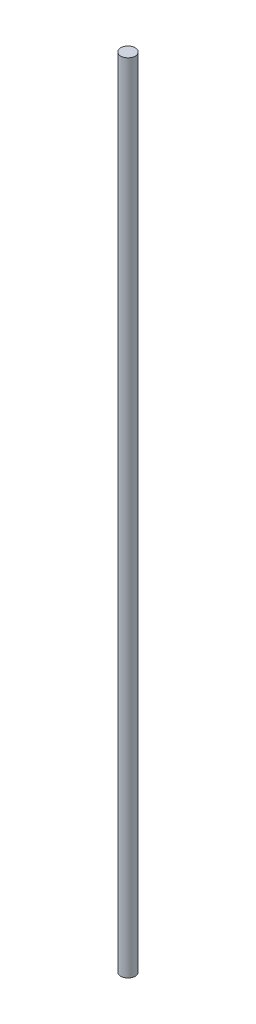
ISO-10303-21;
HEADER;
FILE_DESCRIPTION(('STEP AP214'),'2;1');
FILE_NAME('part.step','',(''),(''),'','','');
FILE_SCHEMA(('AUTOMOTIVE_DESIGN { 1 0 10303 214 1 1 1 1 }'));
ENDSEC;
DATA;
#1=APPLICATION_CONTEXT('core data for automotive mechanical design processes');
#2=APPLICATION_PROTOCOL_DEFINITION('international standard','automotive_design',2000,#1);
#3=PRODUCT_CONTEXT('',#1,'mechanical');
#4=PRODUCT('Part','Part','',(#3));
#5=PRODUCT_RELATED_PRODUCT_CATEGORY('part','',(#4));
#6=PRODUCT_DEFINITION_FORMATION('','',#4);
#7=PRODUCT_DEFINITION_CONTEXT('part definition',#1,'design');
#8=PRODUCT_DEFINITION('design','',#6,#7);
#9=PRODUCT_DEFINITION_SHAPE('','',#8);
#10=(LENGTH_UNIT() NAMED_UNIT(*) SI_UNIT(.MILLI.,.METRE.));
#11=(NAMED_UNIT(*) PLANE_ANGLE_UNIT() SI_UNIT($,.RADIAN.));
#12=(NAMED_UNIT(*) SI_UNIT($,.STERADIAN.) SOLID_ANGLE_UNIT());
#13=UNCERTAINTY_MEASURE_WITH_UNIT(LENGTH_MEASURE(1.E-05),#10,'distance_accuracy_value','');
#14=(GEOMETRIC_REPRESENTATION_CONTEXT(3) GLOBAL_UNCERTAINTY_ASSIGNED_CONTEXT((#13)) GLOBAL_UNIT_ASSIGNED_CONTEXT((#10,
#11,#12)) REPRESENTATION_CONTEXT('',''));
#15=CARTESIAN_POINT('',(0.,0.,0.));
#16=DIRECTION('',(0.,0.,1.));
#17=DIRECTION('',(1.,0.,0.));
#18=AXIS2_PLACEMENT_3D('',#15,#16,#17);
#19=CARTESIAN_POINT('',(0.,220.,0.));
#20=DIRECTION('',(0.,-1.,0.));
#21=DIRECTION('',(0.,0.,-1.));
#22=AXIS2_PLACEMENT_3D('',#19,#20,#21);
#23=CYLINDRICAL_SURFACE('',#22,2.);
#24=CARTESIAN_POINT('',(0.,220.,0.));
#25=DIRECTION('',(0.,1.,0.));
#26=DIRECTION('',(0.,0.,1.));
#27=AXIS2_PLACEMENT_3D('',#24,#25,#26);
#28=CIRCLE('',#27,2.);
#29=CARTESIAN_POINT('',(0.,220.,2.));
#30=VERTEX_POINT('',#29);
#31=EDGE_CURVE('E10',#30,#30,#28,.T.);
#32=ORIENTED_EDGE('',*,*,#31,.F.);
#33=EDGE_LOOP('',(#32));
#34=FACE_BOUND('',#33,.T.);
#35=CARTESIAN_POINT('',(0.,0.,0.));
#36=DIRECTION('',(0.,1.,0.));
#37=DIRECTION('',(0.,0.,1.));
#38=AXIS2_PLACEMENT_3D('',#35,#36,#37);
#39=CIRCLE('',#38,2.);
#40=CARTESIAN_POINT('',(0.,0.,2.));
#41=VERTEX_POINT('',#40);
#42=EDGE_CURVE('E34',#41,#41,#39,.T.);
#43=ORIENTED_EDGE('',*,*,#42,.T.);
#44=EDGE_LOOP('',(#43));
#45=FACE_BOUND('',#44,.T.);
#46=ADVANCED_FACE('F31',(#34,#45),#23,.T.);
#47=CARTESIAN_POINT('',(0.,220.,0.));
#48=DIRECTION('',(0.,1.,0.));
#49=DIRECTION('',(0.,0.,1.));
#50=AXIS2_PLACEMENT_3D('',#47,#48,#49);
#51=PLANE('',#50);
#52=ORIENTED_EDGE('',*,*,#31,.T.);
#53=EDGE_LOOP('',(#52));
#54=FACE_BOUND('',#53,.T.);
#55=ADVANCED_FACE('F46',(#54),#51,.T.);
#56=CARTESIAN_POINT('',(0.,0.,0.));
#57=DIRECTION('',(0.,1.,0.));
#58=DIRECTION('',(0.,0.,1.));
#59=AXIS2_PLACEMENT_3D('',#56,#57,#58);
#60=PLANE('',#59);
#61=ORIENTED_EDGE('',*,*,#42,.F.);
#62=EDGE_LOOP('',(#61));
#63=FACE_BOUND('',#62,.T.);
#64=ADVANCED_FACE('F44',(#63),#60,.F.);
#65=CLOSED_SHELL('',(#46,#55,#64));
#66=MANIFOLD_SOLID_BREP('B2',#65);
#67=ADVANCED_BREP_SHAPE_REPRESENTATION('',(#18,#66),#14);
#68=SHAPE_DEFINITION_REPRESENTATION(#9,#67);
ENDSEC;
END-ISO-10303-21;
